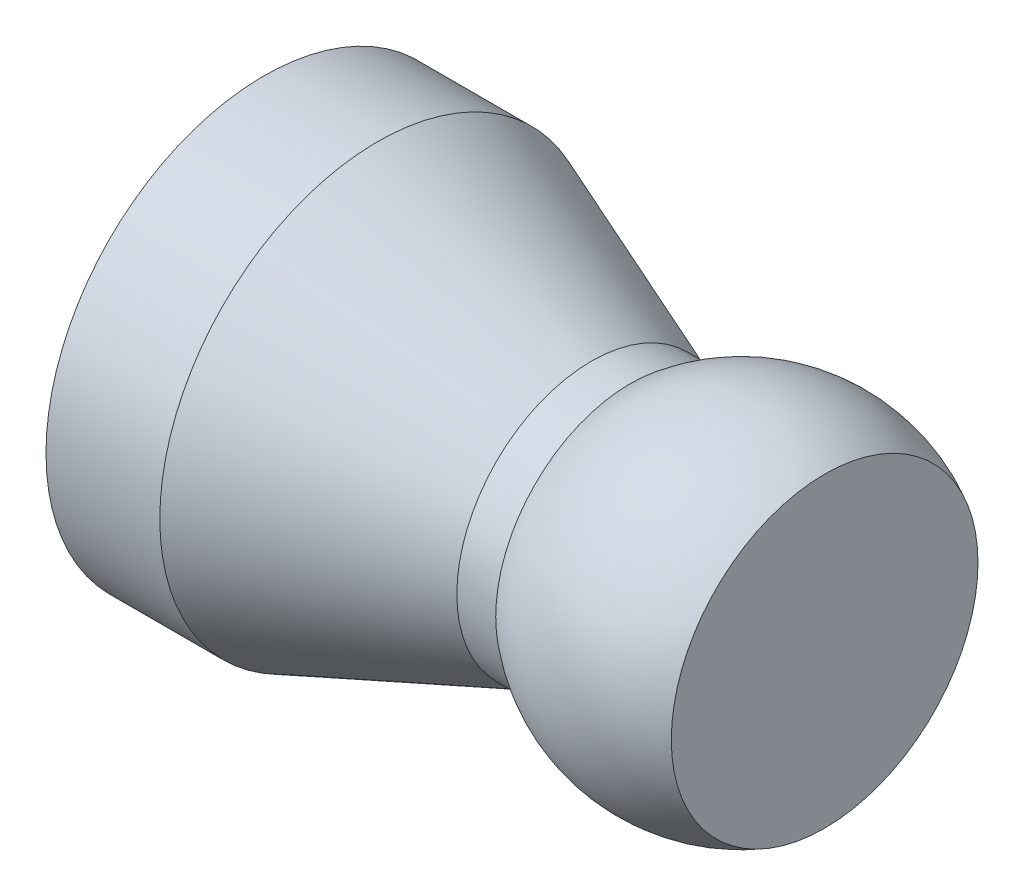
ISO-10303-21;
HEADER;
FILE_DESCRIPTION(('STEP AP214'),'2;1');
FILE_NAME('part.step','',(''),(''),'','','');
FILE_SCHEMA(('AUTOMOTIVE_DESIGN { 1 0 10303 214 1 1 1 1 }'));
ENDSEC;
DATA;
#1=APPLICATION_CONTEXT('core data for automotive mechanical design processes');
#2=APPLICATION_PROTOCOL_DEFINITION('international standard','automotive_design',2000,#1);
#3=PRODUCT_CONTEXT('',#1,'mechanical');
#4=PRODUCT('Part','Part','',(#3));
#5=PRODUCT_RELATED_PRODUCT_CATEGORY('part','',(#4));
#6=PRODUCT_DEFINITION_FORMATION('','',#4);
#7=PRODUCT_DEFINITION_CONTEXT('part definition',#1,'design');
#8=PRODUCT_DEFINITION('design','',#6,#7);
#9=PRODUCT_DEFINITION_SHAPE('','',#8);
#10=(LENGTH_UNIT() NAMED_UNIT(*) SI_UNIT(.MILLI.,.METRE.));
#11=(NAMED_UNIT(*) PLANE_ANGLE_UNIT() SI_UNIT($,.RADIAN.));
#12=(NAMED_UNIT(*) SI_UNIT($,.STERADIAN.) SOLID_ANGLE_UNIT());
#13=UNCERTAINTY_MEASURE_WITH_UNIT(LENGTH_MEASURE(1.E-05),#10,'distance_accuracy_value','');
#14=(GEOMETRIC_REPRESENTATION_CONTEXT(3) GLOBAL_UNCERTAINTY_ASSIGNED_CONTEXT((#13)) GLOBAL_UNIT_ASSIGNED_CONTEXT((#10,
#11,#12)) REPRESENTATION_CONTEXT('',''));
#15=CARTESIAN_POINT('',(0.,0.,0.));
#16=DIRECTION('',(0.,0.,1.));
#17=DIRECTION('',(1.,0.,0.));
#18=AXIS2_PLACEMENT_3D('',#15,#16,#17);
#19=CARTESIAN_POINT('',(0.,0.,0.));
#20=DIRECTION('',(1.,0.,0.));
#21=DIRECTION('',(0.,0.,-1.));
#22=AXIS2_PLACEMENT_3D('',#19,#20,#21);
#23=PLANE('',#22);
#24=CARTESIAN_POINT('',(0.,0.,0.));
#25=DIRECTION('',(-1.,0.,0.));
#26=DIRECTION('',(0.,0.,1.));
#27=AXIS2_PLACEMENT_3D('',#24,#25,#26);
#28=CIRCLE('',#27,7.85);
#29=CARTESIAN_POINT('',(0.,0.,7.85));
#30=VERTEX_POINT('',#29);
#31=EDGE_CURVE('E10',#30,#30,#28,.T.);
#32=ORIENTED_EDGE('',*,*,#31,.T.);
#33=EDGE_LOOP('',(#32));
#34=FACE_BOUND('',#33,.T.);
#35=CARTESIAN_POINT('',(0.,0.,0.));
#36=DIRECTION('',(1.,0.,0.));
#37=DIRECTION('',(0.,0.,-1.));
#38=AXIS2_PLACEMENT_3D('',#35,#36,#37);
#39=CIRCLE('',#38,5.67715441484552);
#40=CARTESIAN_POINT('',(0.,0.,-5.67715441484552));
#41=VERTEX_POINT('',#40);
#42=EDGE_CURVE('E34',#41,#41,#39,.F.);
#43=ORIENTED_EDGE('',*,*,#42,.F.);
#44=EDGE_LOOP('',(#43));
#45=FACE_BOUND('',#44,.T.);
#46=ADVANCED_FACE('F31',(#34,#45),#23,.F.);
#47=CARTESIAN_POINT('',(20.2,0.,0.));
#48=DIRECTION('',(-1.,0.,0.));
#49=DIRECTION('',(0.,0.,1.));
#50=AXIS2_PLACEMENT_3D('',#47,#48,#49);
#51=CYLINDRICAL_SURFACE('',#50,7.85);
#52=ORIENTED_EDGE('',*,*,#31,.F.);
#53=EDGE_LOOP('',(#52));
#54=FACE_BOUND('',#53,.T.);
#55=CARTESIAN_POINT('',(4.1,0.,0.));
#56=DIRECTION('',(-1.,0.,0.));
#57=DIRECTION('',(0.,0.,1.));
#58=AXIS2_PLACEMENT_3D('',#55,#56,#57);
#59=CIRCLE('',#58,7.85);
#60=CARTESIAN_POINT('',(4.1,0.,7.85));
#61=VERTEX_POINT('',#60);
#62=EDGE_CURVE('E38',#61,#61,#59,.T.);
#63=ORIENTED_EDGE('',*,*,#62,.T.);
#64=EDGE_LOOP('',(#63));
#65=FACE_BOUND('',#64,.T.);
#66=ADVANCED_FACE('F60',(#54,#65),#51,.T.);
#67=CARTESIAN_POINT('',(11.8,0.,0.));
#68=DIRECTION('',(-1.,0.,0.));
#69=DIRECTION('',(0.,0.,1.));
#70=AXIS2_PLACEMENT_3D('',#67,#68,#69);
#71=CONICAL_SURFACE('',#70,4.85,0.371517855146709);
#72=ORIENTED_EDGE('',*,*,#62,.F.);
#73=EDGE_LOOP('',(#72));
#74=FACE_BOUND('',#73,.T.);
#75=CARTESIAN_POINT('',(11.8,0.,0.));
#76=DIRECTION('',(-1.,0.,0.));
#77=DIRECTION('',(0.,0.,1.));
#78=AXIS2_PLACEMENT_3D('',#75,#76,#77);
#79=CIRCLE('',#78,4.85);
#80=CARTESIAN_POINT('',(11.8,0.,4.85));
#81=VERTEX_POINT('',#80);
#82=EDGE_CURVE('E42',#81,#81,#79,.T.);
#83=ORIENTED_EDGE('',*,*,#82,.T.);
#84=EDGE_LOOP('',(#83));
#85=FACE_BOUND('',#84,.T.);
#86=ADVANCED_FACE('F64',(#74,#85),#71,.T.);
#87=CARTESIAN_POINT('',(20.2,0.,0.));
#88=DIRECTION('',(-1.,0.,0.));
#89=DIRECTION('',(0.,0.,1.));
#90=AXIS2_PLACEMENT_3D('',#87,#88,#89);
#91=CYLINDRICAL_SURFACE('',#90,4.85);
#92=ORIENTED_EDGE('',*,*,#82,.F.);
#93=EDGE_LOOP('',(#92));
#94=FACE_BOUND('',#93,.T.);
#95=CARTESIAN_POINT('',(13.2003022301679,0.,0.));
#96=DIRECTION('',(-1.,0.,0.));
#97=DIRECTION('',(0.,0.,1.));
#98=AXIS2_PLACEMENT_3D('',#95,#96,#97);
#99=CIRCLE('',#98,4.85);
#100=CARTESIAN_POINT('',(13.2003022301679,4.85,0.));
#101=VERTEX_POINT('',#100);
#102=EDGE_CURVE('E47',#101,#101,#99,.T.);
#103=ORIENTED_EDGE('',*,*,#102,.T.);
#104=EDGE_LOOP('',(#103));
#105=FACE_BOUND('',#104,.T.);
#106=ADVANCED_FACE('F69',(#94,#105),#91,.T.);
#107=CARTESIAN_POINT('',(17.2,0.,0.));
#108=DIRECTION('',(-1.,0.,0.));
#109=DIRECTION('',(0.,1.,0.));
#110=AXIS2_PLACEMENT_3D('',#107,#108,#109);
#111=SPHERICAL_SURFACE('',#110,6.28650000000002);
#112=CARTESIAN_POINT('',(20.2,0.,0.));
#113=DIRECTION('',(-1.,0.,0.));
#114=DIRECTION('',(0.,0.,1.));
#115=AXIS2_PLACEMENT_3D('',#112,#113,#114);
#116=CIRCLE('',#115,5.52449837089305);
#117=CARTESIAN_POINT('',(20.2,5.52449837089305,0.));
#118=VERTEX_POINT('',#117);
#119=EDGE_CURVE('E50',#118,#118,#116,.T.);
#120=CARTESIAN_POINT('',(13.2003022301679,4.85,0.));
#121=CARTESIAN_POINT('',(13.2602745842413,4.89945892110032,0.));
#122=CARTESIAN_POINT('',(13.3211651605767,4.94780434163432,0.));
#123=CARTESIAN_POINT('',(13.4446970725305,5.04220414465337,0.));
#124=CARTESIAN_POINT('',(13.5073384081489,5.08825852713841,0.));
#125=CARTESIAN_POINT('',(13.6342861534278,5.17801221714323,0.));
#126=CARTESIAN_POINT('',(13.6985925630882,5.221711524663,0.));
#127=CARTESIAN_POINT('',(13.8287818345717,5.3066951130985,0.));
#128=CARTESIAN_POINT('',(13.8946646963948,5.34797939401423,0.));
#129=CARTESIAN_POINT('',(14.0279162540907,5.42807607433718,0.));
#130=CARTESIAN_POINT('',(14.0952849499637,5.4668884737444,0.));
#131=CARTESIAN_POINT('',(14.2314154667979,5.54198799809576,0.));
#132=CARTESIAN_POINT('',(14.3001772877591,5.57827512303989,0.));
#133=CARTESIAN_POINT('',(14.4389994412894,5.648274164032,0.));
#134=CARTESIAN_POINT('',(14.5090597738585,5.68198608007998,0.));
#135=CARTESIAN_POINT('',(14.6503825470477,5.74678831668237,0.));
#136=CARTESIAN_POINT('',(14.7216449876678,5.77787863723679,0.));
#137=CARTESIAN_POINT('',(14.865273920196,5.83739490239718,0.));
#138=CARTESIAN_POINT('',(14.9376404121041,5.86582084700316,0.));
#139=CARTESIAN_POINT('',(15.0833778710342,5.9199692462995,0.));
#140=CARTESIAN_POINT('',(15.1567488380563,5.94569170098987,0.));
#141=CARTESIAN_POINT('',(15.3043942889491,5.99439772639984,0.));
#142=CARTESIAN_POINT('',(15.3786687728199,6.01738129711945,0.));
#143=CARTESIAN_POINT('',(15.5280190558904,6.06057792925313,0.));
#144=CARTESIAN_POINT('',(15.6030948550902,6.08079099066721,0.));
#145=CARTESIAN_POINT('',(15.7539444646958,6.11841879106337,0.));
#146=CARTESIAN_POINT('',(15.8297182751017,6.13583353004546,0.));
#147=CARTESIAN_POINT('',(15.9818596425334,6.1678407229379,0.));
#148=CARTESIAN_POINT('',(16.0582271995593,6.18243317684825,0.));
#149=CARTESIAN_POINT('',(16.2114509786516,6.20877572041472,0.));
#150=CARTESIAN_POINT('',(16.2883072007179,6.22052581007083,0.));
#151=CARTESIAN_POINT('',(16.4424025559092,6.24116745703296,0.));
#152=CARTESIAN_POINT('',(16.5196416890342,6.25005901433898,0.));
#153=CARTESIAN_POINT('',(16.6743965854766,6.2649713618389,0.));
#154=CARTESIAN_POINT('',(16.751912348794,6.27099215203279,0.));
#155=CARTESIAN_POINT('',(16.9071138441122,6.28015468071523,0.));
#156=CARTESIAN_POINT('',(16.984799576113,6.28329641920379,0.));
#157=CARTESIAN_POINT('',(17.1402341134127,6.28669652145072,0.));
#158=CARTESIAN_POINT('',(17.2179829187115,6.28695488520909,0.));
#159=CARTESIAN_POINT('',(17.3734366204332,6.28458788248785,0.));
#160=CARTESIAN_POINT('',(17.4511415168561,6.28196251600824,0.));
#161=CARTESIAN_POINT('',(17.6064004790699,6.27383166530875,0.));
#162=CARTESIAN_POINT('',(17.683954544861,6.26832618108888,0.));
#163=CARTESIAN_POINT('',(17.838805131599,6.25444267044373,0.));
#164=CARTESIAN_POINT('',(17.9161016525459,6.24606464401844,0.));
#165=CARTESIAN_POINT('',(18.0703307897612,6.22644757710186,0.));
#166=CARTESIAN_POINT('',(18.1472634060295,6.21520853661056,0.));
#167=CARTESIAN_POINT('',(18.3006588747975,6.18988490647531,0.));
#168=CARTESIAN_POINT('',(18.3771217272972,6.17580031683137,0.));
#169=CARTESIAN_POINT('',(18.5294724557849,6.14480496867872,0.));
#170=CARTESIAN_POINT('',(18.6053603317729,6.12789421017002,0.));
#171=CARTESIAN_POINT('',(18.7564566858354,6.09126979373,0.));
#172=CARTESIAN_POINT('',(18.8316651639099,6.07155613579867,0.));
#173=CARTESIAN_POINT('',(18.981299234941,6.02935304542305,0.));
#174=CARTESIAN_POINT('',(19.0557248278977,6.00686361297877,0.));
#175=CARTESIAN_POINT('',(19.2036907211717,5.95913992285563,0.));
#176=CARTESIAN_POINT('',(19.2772310214891,5.93390566517678,0.));
#177=CARTESIAN_POINT('',(19.423325131037,5.88072703241355,0.));
#178=CARTESIAN_POINT('',(19.4958789402675,5.85278265732917,0.));
#179=CARTESIAN_POINT('',(19.6399002605155,5.79422229507947,0.));
#180=CARTESIAN_POINT('',(19.7113677715328,5.76360630791413,0.));
#181=CARTESIAN_POINT('',(19.8531180564118,5.6997446477602,0.));
#182=CARTESIAN_POINT('',(19.9234008302733,5.66649897477159,0.));
#183=CARTESIAN_POINT('',(20.062685304422,5.59742444008544,0.));
#184=CARTESIAN_POINT('',(20.1316870047092,5.5615955783879,0.));
#185=CARTESIAN_POINT('',(20.2,5.52449837089305,0.));
#186=B_SPLINE_CURVE_WITH_KNOTS('',3,(#120,#121,#122,#123,#124,#125,#126,#127,#128,#129,#130,
#131,#132,#133,#134,#135,#136,#137,#138,#139,#140,#141,#142,#143,#144,#145,#146,#147,#148,#149,
#150,#151,#152,#153,#154,#155,#156,#157,#158,#159,#160,#161,#162,#163,#164,#165,#166,#167,#168,
#169,#170,#171,#172,#173,#174,#175,#176,#177,#178,#179,#180,#181,#182,#183,#184,#185),
.UNSPECIFIED.,.F.,.F.,(4,2,2,2,2,2,2,2,2,2,2,2,2,2,2,2,2,2,2,2,2,2,2,2,2,2,2,2,2,2,2,2,4),(0.,
0.233194212347119,0.466388424694238,0.699582637041357,0.932776849388478,1.1659710617356,
1.39916527408272,1.63235948642984,1.86555369877696,2.09874791112408,2.3319421234712,
2.56513633581832,2.79833054816544,3.03152476051255,3.26471897285967,3.49791318520679,
3.73110739755391,3.96430160990103,4.19749582224815,4.43069003459527,4.66388424694239,
4.89707845928951,5.13027267163663,5.36346688398375,5.59666109633087,5.82985530867799,
6.06304952102511,6.29624373337223,6.52943794571935,6.76263215806647,6.99582637041359,
7.22902058276071,7.46221479510783),.UNSPECIFIED.);
#187=EDGE_CURVE('BSEAM76',#101,#118,#186,.T.);
#188=ORIENTED_EDGE('',*,*,#102,.F.);
#189=ORIENTED_EDGE('',*,*,#119,.T.);
#190=ORIENTED_EDGE('',*,*,#187,.T.);
#191=ORIENTED_EDGE('',*,*,#187,.F.);
#192=EDGE_LOOP('',(#188,#190,#189,#191));
#193=FACE_BOUND('',#192,.T.);
#194=ADVANCED_FACE('F76',(#193),#111,.T.);
#195=CARTESIAN_POINT('',(20.2,5.52449837089305,0.));
#196=DIRECTION('',(-1.,0.,0.));
#197=DIRECTION('',(0.,0.,1.));
#198=AXIS2_PLACEMENT_3D('',#195,#196,#197);
#199=PLANE('',#198);
#200=ORIENTED_EDGE('',*,*,#119,.F.);
#201=EDGE_LOOP('',(#200));
#202=FACE_BOUND('',#201,.T.);
#203=ADVANCED_FACE('F80',(#202),#199,.F.);
#204=CARTESIAN_POINT('',(2.7,0.,0.));
#205=DIRECTION('',(-1.,0.,0.));
#206=DIRECTION('',(0.,1.,0.));
#207=AXIS2_PLACEMENT_3D('',#204,#205,#206);
#208=SPHERICAL_SURFACE('',#207,6.2865);
#209=ORIENTED_EDGE('',*,*,#42,.T.);
#210=EDGE_LOOP('',(#209));
#211=FACE_BOUND('',#210,.T.);
#212=ADVANCED_FACE('F57',(#211),#208,.F.);
#213=CLOSED_SHELL('',(#46,#66,#86,#106,#194,#203,#212));
#214=MANIFOLD_SOLID_BREP('B2',#213);
#215=ADVANCED_BREP_SHAPE_REPRESENTATION('',(#18,#214),#14);
#216=SHAPE_DEFINITION_REPRESENTATION(#9,#215);
ENDSEC;
END-ISO-10303-21;
